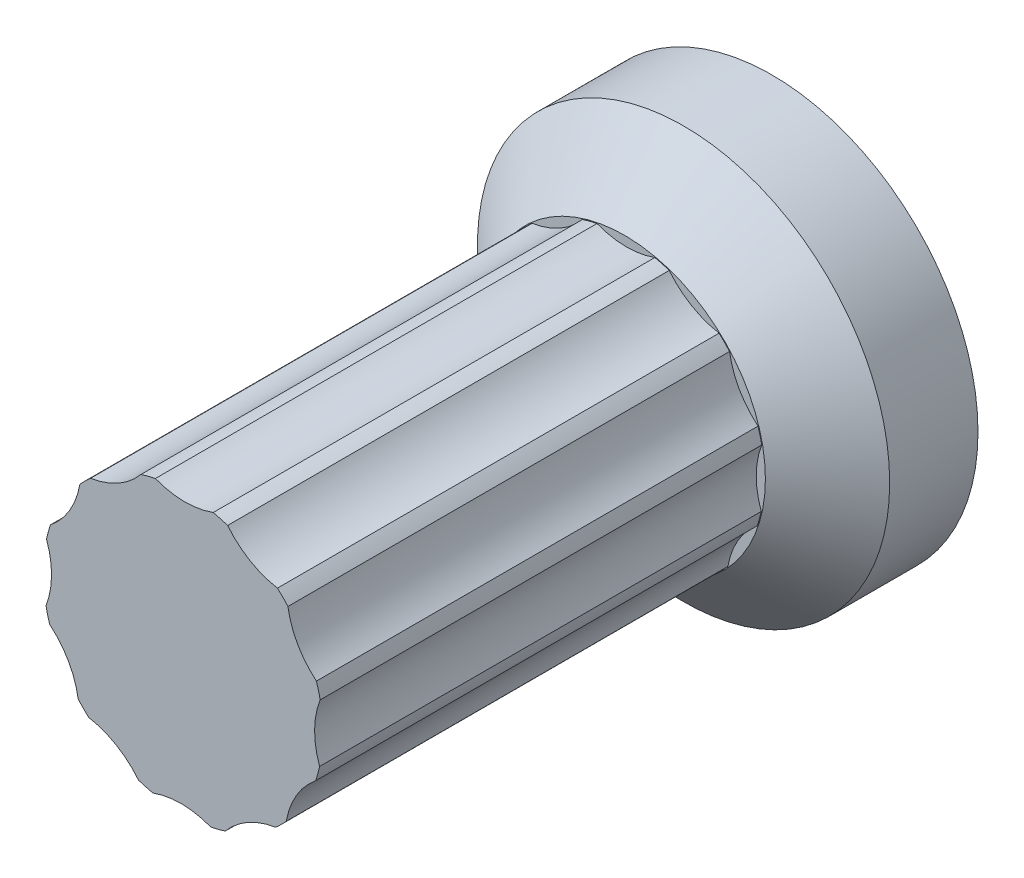
ISO-10303-21;
HEADER;
FILE_DESCRIPTION(('STEP AP214'),'2;1');
FILE_NAME('part.step','',(''),(''),'','','');
FILE_SCHEMA(('AUTOMOTIVE_DESIGN { 1 0 10303 214 1 1 1 1 }'));
ENDSEC;
DATA;
#1=APPLICATION_CONTEXT('core data for automotive mechanical design processes');
#2=APPLICATION_PROTOCOL_DEFINITION('international standard','automotive_design',2000,#1);
#3=PRODUCT_CONTEXT('',#1,'mechanical');
#4=PRODUCT('Part','Part','',(#3));
#5=PRODUCT_RELATED_PRODUCT_CATEGORY('part','',(#4));
#6=PRODUCT_DEFINITION_FORMATION('','',#4);
#7=PRODUCT_DEFINITION_CONTEXT('part definition',#1,'design');
#8=PRODUCT_DEFINITION('design','',#6,#7);
#9=PRODUCT_DEFINITION_SHAPE('','',#8);
#10=(LENGTH_UNIT() NAMED_UNIT(*) SI_UNIT(.MILLI.,.METRE.));
#11=(NAMED_UNIT(*) PLANE_ANGLE_UNIT() SI_UNIT($,.RADIAN.));
#12=(NAMED_UNIT(*) SI_UNIT($,.STERADIAN.) SOLID_ANGLE_UNIT());
#13=UNCERTAINTY_MEASURE_WITH_UNIT(LENGTH_MEASURE(1.E-05),#10,'distance_accuracy_value','');
#14=(GEOMETRIC_REPRESENTATION_CONTEXT(3) GLOBAL_UNCERTAINTY_ASSIGNED_CONTEXT((#13)) GLOBAL_UNIT_ASSIGNED_CONTEXT((#10,
#11,#12)) REPRESENTATION_CONTEXT('',''));
#15=CARTESIAN_POINT('',(0.,0.,0.));
#16=DIRECTION('',(0.,0.,1.));
#17=DIRECTION('',(1.,0.,0.));
#18=AXIS2_PLACEMENT_3D('',#15,#16,#17);
#19=CARTESIAN_POINT('',(0.,0.,20.));
#20=DIRECTION('',(0.,0.,-1.));
#21=DIRECTION('',(-1.,0.,0.));
#22=AXIS2_PLACEMENT_3D('',#19,#20,#21);
#23=CYLINDRICAL_SURFACE('',#22,4.75);
#24=CARTESIAN_POINT('',(0.,0.,5.));
#25=DIRECTION('',(0.,0.,1.));
#26=DIRECTION('',(1.,0.,0.));
#27=AXIS2_PLACEMENT_3D('',#24,#25,#26);
#28=CIRCLE('',#27,4.75);
#29=CARTESIAN_POINT('',(-3.14318374274492,3.56130537294179,5.));
#30=VERTEX_POINT('',#29);
#31=CARTESIAN_POINT('',(-3.50480657144831,3.20606158654708,5.));
#32=VERTEX_POINT('',#31);
#33=EDGE_CURVE('E223',#30,#32,#28,.T.);
#34=ORIENTED_EDGE('',*,*,#33,.T.);
#35=DIRECTION('',(0.,0.,1.));
#36=VECTOR('',#35,1.);
#37=CARTESIAN_POINT('',(-3.50480657144831,3.20606158654708,5.));
#38=LINE('',#37,#36);
#39=CARTESIAN_POINT('',(-3.50480657144831,3.20606158654708,20.));
#40=VERTEX_POINT('',#39);
#41=EDGE_CURVE('E202',#32,#40,#38,.T.);
#42=ORIENTED_EDGE('',*,*,#41,.T.);
#43=CARTESIAN_POINT('',(0.,0.,20.));
#44=DIRECTION('',(0.,0.,1.));
#45=DIRECTION('',(1.,0.,0.));
#46=AXIS2_PLACEMENT_3D('',#43,#44,#45);
#47=CIRCLE('',#46,4.75);
#48=CARTESIAN_POINT('',(-3.14318374274492,3.56130537294178,20.));
#49=VERTEX_POINT('',#48);
#50=EDGE_CURVE('E317',#49,#40,#47,.T.);
#51=ORIENTED_EDGE('',*,*,#50,.F.);
#52=DIRECTION('',(0.,0.,1.));
#53=VECTOR('',#52,1.);
#54=CARTESIAN_POINT('',(-3.14318374274492,3.56130537294179,5.));
#55=LINE('',#54,#53);
#56=EDGE_CURVE('E299',#30,#49,#55,.T.);
#57=ORIENTED_EDGE('',*,*,#56,.F.);
#58=EDGE_LOOP('',(#34,#42,#51,#57));
#59=FACE_BOUND('',#58,.T.);
#60=ADVANCED_FACE('F36',(#59),#23,.T.);
#61=CARTESIAN_POINT('',(-4.50272965645025,1.51258905222913,20.));
#62=VERTEX_POINT('',#61);
#63=CARTESIAN_POINT('',(-4.63828231949841,1.02412749432305,20.));
#64=VERTEX_POINT('',#63);
#65=EDGE_CURVE('E216',#62,#64,#47,.T.);
#66=ORIENTED_EDGE('',*,*,#65,.F.);
#67=DIRECTION('',(0.,0.,1.));
#68=VECTOR('',#67,1.);
#69=CARTESIAN_POINT('',(-4.50272965645025,1.51258905222913,5.));
#70=LINE('',#69,#68);
#71=CARTESIAN_POINT('',(-4.50272965645025,1.51258905222913,5.));
#72=VERTEX_POINT('',#71);
#73=EDGE_CURVE('E199',#72,#62,#70,.T.);
#74=ORIENTED_EDGE('',*,*,#73,.F.);
#75=CARTESIAN_POINT('',(-4.63828231949841,1.02412749432305,5.));
#76=VERTEX_POINT('',#75);
#77=EDGE_CURVE('E214',#72,#76,#28,.T.);
#78=ORIENTED_EDGE('',*,*,#77,.T.);
#79=DIRECTION('',(0.,0.,1.));
#80=VECTOR('',#79,1.);
#81=CARTESIAN_POINT('',(-4.63828231949841,1.02412749432305,5.));
#82=LINE('',#81,#80);
#83=EDGE_CURVE('E352',#76,#64,#82,.T.);
#84=ORIENTED_EDGE('',*,*,#83,.T.);
#85=EDGE_LOOP('',(#66,#74,#78,#84));
#86=FACE_BOUND('',#85,.T.);
#87=ADVANCED_FACE('F212',(#86),#23,.T.);
#88=CARTESIAN_POINT('',(-4.65577279497406,-0.941424283508472,20.));
#89=VERTEX_POINT('',#88);
#90=CARTESIAN_POINT('',(-4.52893406577136,-1.43222073295135,20.));
#91=VERTEX_POINT('',#90);
#92=EDGE_CURVE('E344',#89,#91,#47,.T.);
#93=ORIENTED_EDGE('',*,*,#92,.F.);
#94=DIRECTION('',(0.,0.,1.));
#95=VECTOR('',#94,1.);
#96=CARTESIAN_POINT('',(-4.65577279497406,-0.941424283508473,5.));
#97=LINE('',#96,#95);
#98=CARTESIAN_POINT('',(-4.65577279497406,-0.941424283508473,5.));
#99=VERTEX_POINT('',#98);
#100=EDGE_CURVE('E354',#99,#89,#97,.T.);
#101=ORIENTED_EDGE('',*,*,#100,.F.);
#102=CARTESIAN_POINT('',(-4.52893406577136,-1.43222073295135,5.));
#103=VERTEX_POINT('',#102);
#104=EDGE_CURVE('E224',#99,#103,#28,.T.);
#105=ORIENTED_EDGE('',*,*,#104,.T.);
#106=DIRECTION('',(0.,0.,1.));
#107=VECTOR('',#106,1.);
#108=CARTESIAN_POINT('',(-4.52893406577136,-1.43222073295135,5.));
#109=LINE('',#108,#107);
#110=EDGE_CURVE('E359',#103,#91,#109,.T.);
#111=ORIENTED_EDGE('',*,*,#110,.T.);
#112=EDGE_LOOP('',(#93,#101,#105,#111));
#113=FACE_BOUND('',#112,.T.);
#114=ADVANCED_FACE('F263',(#113),#23,.T.);
#115=CARTESIAN_POINT('',(-3.56130537294178,-3.14318374274493,20.));
#116=VERTEX_POINT('',#115);
#117=CARTESIAN_POINT('',(-3.20606158654706,-3.50480657144832,20.));
#118=VERTEX_POINT('',#117);
#119=EDGE_CURVE('E340',#116,#118,#47,.T.);
#120=ORIENTED_EDGE('',*,*,#119,.F.);
#121=DIRECTION('',(0.,0.,1.));
#122=VECTOR('',#121,1.);
#123=CARTESIAN_POINT('',(-3.56130537294178,-3.14318374274494,5.));
#124=LINE('',#123,#122);
#125=CARTESIAN_POINT('',(-3.56130537294178,-3.14318374274494,5.));
#126=VERTEX_POINT('',#125);
#127=EDGE_CURVE('E365',#126,#116,#124,.T.);
#128=ORIENTED_EDGE('',*,*,#127,.F.);
#129=CARTESIAN_POINT('',(-3.20606158654706,-3.50480657144832,5.));
#130=VERTEX_POINT('',#129);
#131=EDGE_CURVE('E228',#126,#130,#28,.T.);
#132=ORIENTED_EDGE('',*,*,#131,.T.);
#133=DIRECTION('',(0.,0.,1.));
#134=VECTOR('',#133,1.);
#135=CARTESIAN_POINT('',(-3.20606158654706,-3.50480657144832,5.));
#136=LINE('',#135,#134);
#137=EDGE_CURVE('E368',#130,#118,#136,.T.);
#138=ORIENTED_EDGE('',*,*,#137,.T.);
#139=EDGE_LOOP('',(#120,#128,#132,#138));
#140=FACE_BOUND('',#139,.T.);
#141=ADVANCED_FACE('F469',(#140),#23,.T.);
#142=CARTESIAN_POINT('',(-1.51258905222912,-4.50272965645025,20.));
#143=VERTEX_POINT('',#142);
#144=CARTESIAN_POINT('',(-1.02412749432307,-4.63828231949841,20.));
#145=VERTEX_POINT('',#144);
#146=EDGE_CURVE('E336',#143,#145,#47,.T.);
#147=ORIENTED_EDGE('',*,*,#146,.F.);
#148=DIRECTION('',(0.,0.,1.));
#149=VECTOR('',#148,1.);
#150=CARTESIAN_POINT('',(-1.51258905222912,-4.50272965645025,5.));
#151=LINE('',#150,#149);
#152=CARTESIAN_POINT('',(-1.51258905222912,-4.50272965645025,5.));
#153=VERTEX_POINT('',#152);
#154=EDGE_CURVE('E375',#153,#143,#151,.T.);
#155=ORIENTED_EDGE('',*,*,#154,.F.);
#156=CARTESIAN_POINT('',(-1.02412749432307,-4.63828231949841,5.));
#157=VERTEX_POINT('',#156);
#158=EDGE_CURVE('E457',#153,#157,#28,.T.);
#159=ORIENTED_EDGE('',*,*,#158,.T.);
#160=DIRECTION('',(0.,0.,1.));
#161=VECTOR('',#160,1.);
#162=CARTESIAN_POINT('',(-1.02412749432307,-4.63828231949841,5.));
#163=LINE('',#162,#161);
#164=EDGE_CURVE('E378',#157,#145,#163,.T.);
#165=ORIENTED_EDGE('',*,*,#164,.T.);
#166=EDGE_LOOP('',(#147,#155,#159,#165));
#167=FACE_BOUND('',#166,.T.);
#168=ADVANCED_FACE('F472',(#167),#23,.T.);
#169=CARTESIAN_POINT('',(0.941424283508456,-4.65577279497406,20.));
#170=VERTEX_POINT('',#169);
#171=CARTESIAN_POINT('',(1.43222073295136,-4.52893406577136,20.));
#172=VERTEX_POINT('',#171);
#173=EDGE_CURVE('E332',#170,#172,#47,.T.);
#174=ORIENTED_EDGE('',*,*,#173,.F.);
#175=DIRECTION('',(0.,0.,1.));
#176=VECTOR('',#175,1.);
#177=CARTESIAN_POINT('',(0.941424283508457,-4.65577279497406,5.));
#178=LINE('',#177,#176);
#179=CARTESIAN_POINT('',(0.941424283508457,-4.65577279497406,5.));
#180=VERTEX_POINT('',#179);
#181=EDGE_CURVE('E385',#180,#170,#178,.T.);
#182=ORIENTED_EDGE('',*,*,#181,.F.);
#183=CARTESIAN_POINT('',(1.43222073295136,-4.52893406577136,5.));
#184=VERTEX_POINT('',#183);
#185=EDGE_CURVE('E452',#180,#184,#28,.T.);
#186=ORIENTED_EDGE('',*,*,#185,.T.);
#187=DIRECTION('',(0.,0.,1.));
#188=VECTOR('',#187,1.);
#189=CARTESIAN_POINT('',(1.43222073295136,-4.52893406577136,5.));
#190=LINE('',#189,#188);
#191=EDGE_CURVE('E388',#184,#172,#190,.T.);
#192=ORIENTED_EDGE('',*,*,#191,.T.);
#193=EDGE_LOOP('',(#174,#182,#186,#192));
#194=FACE_BOUND('',#193,.T.);
#195=ADVANCED_FACE('F585',(#194),#23,.T.);
#196=CARTESIAN_POINT('',(3.14318374274495,-3.56130537294176,20.));
#197=VERTEX_POINT('',#196);
#198=CARTESIAN_POINT('',(3.50480657144833,-3.20606158654705,20.));
#199=VERTEX_POINT('',#198);
#200=EDGE_CURVE('E328',#197,#199,#47,.T.);
#201=ORIENTED_EDGE('',*,*,#200,.F.);
#202=DIRECTION('',(0.,0.,1.));
#203=VECTOR('',#202,1.);
#204=CARTESIAN_POINT('',(3.14318374274495,-3.56130537294176,5.));
#205=LINE('',#204,#203);
#206=CARTESIAN_POINT('',(3.14318374274495,-3.56130537294176,5.));
#207=VERTEX_POINT('',#206);
#208=EDGE_CURVE('E395',#207,#197,#205,.T.);
#209=ORIENTED_EDGE('',*,*,#208,.F.);
#210=CARTESIAN_POINT('',(3.50480657144833,-3.20606158654705,5.));
#211=VERTEX_POINT('',#210);
#212=EDGE_CURVE('E447',#207,#211,#28,.T.);
#213=ORIENTED_EDGE('',*,*,#212,.T.);
#214=DIRECTION('',(0.,0.,1.));
#215=VECTOR('',#214,1.);
#216=CARTESIAN_POINT('',(3.50480657144833,-3.20606158654705,5.));
#217=LINE('',#216,#215);
#218=EDGE_CURVE('E398',#211,#199,#217,.T.);
#219=ORIENTED_EDGE('',*,*,#218,.T.);
#220=EDGE_LOOP('',(#201,#209,#213,#219));
#221=FACE_BOUND('',#220,.T.);
#222=ADVANCED_FACE('F477',(#221),#23,.T.);
#223=CARTESIAN_POINT('',(4.50272965645026,-1.5125890522291,20.));
#224=VERTEX_POINT('',#223);
#225=CARTESIAN_POINT('',(4.63828231949842,-1.02412749432302,20.));
#226=VERTEX_POINT('',#225);
#227=EDGE_CURVE('E324',#224,#226,#47,.T.);
#228=ORIENTED_EDGE('',*,*,#227,.F.);
#229=DIRECTION('',(0.,0.,1.));
#230=VECTOR('',#229,1.);
#231=CARTESIAN_POINT('',(4.50272965645026,-1.5125890522291,5.));
#232=LINE('',#231,#230);
#233=CARTESIAN_POINT('',(4.50272965645026,-1.5125890522291,5.));
#234=VERTEX_POINT('',#233);
#235=EDGE_CURVE('E405',#234,#224,#232,.T.);
#236=ORIENTED_EDGE('',*,*,#235,.F.);
#237=CARTESIAN_POINT('',(4.63828231949842,-1.02412749432302,5.));
#238=VERTEX_POINT('',#237);
#239=EDGE_CURVE('E442',#234,#238,#28,.T.);
#240=ORIENTED_EDGE('',*,*,#239,.T.);
#241=DIRECTION('',(0.,0.,1.));
#242=VECTOR('',#241,1.);
#243=CARTESIAN_POINT('',(4.63828231949842,-1.02412749432302,5.));
#244=LINE('',#243,#242);
#245=EDGE_CURVE('E408',#238,#226,#244,.T.);
#246=ORIENTED_EDGE('',*,*,#245,.T.);
#247=EDGE_LOOP('',(#228,#236,#240,#246));
#248=FACE_BOUND('',#247,.T.);
#249=ADVANCED_FACE('F592',(#248),#23,.T.);
#250=CARTESIAN_POINT('',(4.65577279497405,0.941424283508504,20.));
#251=VERTEX_POINT('',#250);
#252=CARTESIAN_POINT('',(4.52893406577135,1.43222073295138,20.));
#253=VERTEX_POINT('',#252);
#254=EDGE_CURVE('E321',#251,#253,#47,.T.);
#255=ORIENTED_EDGE('',*,*,#254,.F.);
#256=DIRECTION('',(0.,0.,1.));
#257=VECTOR('',#256,1.);
#258=CARTESIAN_POINT('',(4.65577279497405,0.941424283508505,5.));
#259=LINE('',#258,#257);
#260=CARTESIAN_POINT('',(4.65577279497405,0.941424283508505,5.));
#261=VERTEX_POINT('',#260);
#262=EDGE_CURVE('E415',#261,#251,#259,.T.);
#263=ORIENTED_EDGE('',*,*,#262,.F.);
#264=CARTESIAN_POINT('',(4.52893406577135,1.43222073295138,5.));
#265=VERTEX_POINT('',#264);
#266=EDGE_CURVE('E440',#261,#265,#28,.T.);
#267=ORIENTED_EDGE('',*,*,#266,.T.);
#268=DIRECTION('',(0.,0.,1.));
#269=VECTOR('',#268,1.);
#270=CARTESIAN_POINT('',(4.52893406577135,1.43222073295138,5.));
#271=LINE('',#270,#269);
#272=EDGE_CURVE('E418',#265,#253,#271,.T.);
#273=ORIENTED_EDGE('',*,*,#272,.T.);
#274=EDGE_LOOP('',(#255,#263,#267,#273));
#275=FACE_BOUND('',#274,.T.);
#276=ADVANCED_FACE('F284',(#275),#23,.T.);
#277=CARTESIAN_POINT('',(3.56130537294175,3.14318374274496,20.));
#278=VERTEX_POINT('',#277);
#279=CARTESIAN_POINT('',(3.20606158654704,3.50480657144834,20.));
#280=VERTEX_POINT('',#279);
#281=EDGE_CURVE('E319',#278,#280,#47,.T.);
#282=ORIENTED_EDGE('',*,*,#281,.F.);
#283=DIRECTION('',(0.,0.,1.));
#284=VECTOR('',#283,1.);
#285=CARTESIAN_POINT('',(3.56130537294175,3.14318374274496,5.));
#286=LINE('',#285,#284);
#287=CARTESIAN_POINT('',(3.56130537294175,3.14318374274496,5.));
#288=VERTEX_POINT('',#287);
#289=EDGE_CURVE('E59',#288,#278,#286,.T.);
#290=ORIENTED_EDGE('',*,*,#289,.F.);
#291=CARTESIAN_POINT('',(3.20606158654704,3.50480657144834,5.));
#292=VERTEX_POINT('',#291);
#293=EDGE_CURVE('E438',#288,#292,#28,.T.);
#294=ORIENTED_EDGE('',*,*,#293,.T.);
#295=DIRECTION('',(0.,0.,1.));
#296=VECTOR('',#295,1.);
#297=CARTESIAN_POINT('',(3.20606158654704,3.50480657144834,5.));
#298=LINE('',#297,#296);
#299=EDGE_CURVE('E427',#292,#280,#298,.T.);
#300=ORIENTED_EDGE('',*,*,#299,.T.);
#301=EDGE_LOOP('',(#282,#290,#294,#300));
#302=FACE_BOUND('',#301,.T.);
#303=ADVANCED_FACE('F277',(#302),#23,.T.);
#304=CARTESIAN_POINT('',(-0.941424283508457,4.65577279497406,5.));
#305=VERTEX_POINT('',#304);
#306=CARTESIAN_POINT('',(-1.43222073295133,4.52893406577136,5.));
#307=VERTEX_POINT('',#306);
#308=EDGE_CURVE('E226',#305,#307,#28,.T.);
#309=ORIENTED_EDGE('',*,*,#308,.T.);
#310=DIRECTION('',(0.,0.,1.));
#311=VECTOR('',#310,1.);
#312=CARTESIAN_POINT('',(-1.43222073295133,4.52893406577136,5.));
#313=LINE('',#312,#311);
#314=CARTESIAN_POINT('',(-1.43222073295133,4.52893406577136,20.));
#315=VERTEX_POINT('',#314);
#316=EDGE_CURVE('E289',#307,#315,#313,.T.);
#317=ORIENTED_EDGE('',*,*,#316,.T.);
#318=CARTESIAN_POINT('',(-0.941424283508456,4.65577279497406,20.));
#319=VERTEX_POINT('',#318);
#320=EDGE_CURVE('E234',#319,#315,#47,.T.);
#321=ORIENTED_EDGE('',*,*,#320,.F.);
#322=DIRECTION('',(0.,0.,1.));
#323=VECTOR('',#322,1.);
#324=CARTESIAN_POINT('',(-0.941424283508457,4.65577279497406,5.));
#325=LINE('',#324,#323);
#326=EDGE_CURVE('E291',#305,#319,#325,.T.);
#327=ORIENTED_EDGE('',*,*,#326,.F.);
#328=EDGE_LOOP('',(#309,#317,#321,#327));
#329=FACE_BOUND('',#328,.T.);
#330=ADVANCED_FACE('F268',(#329),#23,.T.);
#331=CARTESIAN_POINT('',(0.,0.,5.));
#332=DIRECTION('',(0.,0.,-1.));
#333=DIRECTION('',(-1.,0.,0.));
#334=AXIS2_PLACEMENT_3D('',#331,#332,#333);
#335=CYLINDRICAL_SURFACE('',#334,7.);
#336=CARTESIAN_POINT('',(0.,0.,3.));
#337=DIRECTION('',(0.,0.,1.));
#338=DIRECTION('',(1.,0.,0.));
#339=AXIS2_PLACEMENT_3D('',#336,#337,#338);
#340=CIRCLE('',#339,7.);
#341=CARTESIAN_POINT('',(7.,0.,3.));
#342=VERTEX_POINT('',#341);
#343=EDGE_CURVE('E11',#342,#342,#340,.F.);
#344=ORIENTED_EDGE('',*,*,#343,.T.);
#345=EDGE_LOOP('',(#344));
#346=FACE_BOUND('',#345,.T.);
#347=CARTESIAN_POINT('',(0.,0.,0.));
#348=DIRECTION('',(0.,0.,1.));
#349=DIRECTION('',(1.,0.,0.));
#350=AXIS2_PLACEMENT_3D('',#347,#348,#349);
#351=CIRCLE('',#350,7.);
#352=CARTESIAN_POINT('',(7.,0.,0.));
#353=VERTEX_POINT('',#352);
#354=EDGE_CURVE('E236',#353,#353,#351,.T.);
#355=ORIENTED_EDGE('',*,*,#354,.T.);
#356=EDGE_LOOP('',(#355));
#357=FACE_BOUND('',#356,.T.);
#358=ADVANCED_FACE('F276',(#346,#357),#335,.T.);
#359=CARTESIAN_POINT('',(0.,0.,5.));
#360=DIRECTION('',(0.,0.,1.));
#361=DIRECTION('',(1.,0.,0.));
#362=AXIS2_PLACEMENT_3D('',#359,#360,#361);
#363=PLANE('',#362);
#364=CARTESIAN_POINT('',(0.,0.,5.));
#365=DIRECTION('',(0.,0.,1.));
#366=DIRECTION('',(1.,0.,0.));
#367=AXIS2_PLACEMENT_3D('',#364,#365,#366);
#368=CIRCLE('',#367,4.77877497034162);
#369=CARTESIAN_POINT('',(4.77877497034162,0.,5.));
#370=VERTEX_POINT('',#369);
#371=EDGE_CURVE('E44',#370,#370,#368,.T.);
#372=ORIENTED_EDGE('',*,*,#371,.T.);
#373=EDGE_LOOP('',(#372));
#374=FACE_BOUND('',#373,.T.);
#375=ORIENTED_EDGE('',*,*,#308,.F.);
#376=CARTESIAN_POINT('',(0.0644882214723457,7.2470836222042,5.));
#377=DIRECTION('',(0.,0.,1.));
#378=DIRECTION('',(1.,0.,0.));
#379=AXIS2_PLACEMENT_3D('',#376,#377,#378);
#380=CIRCLE('',#379,2.77970354012742);
#381=CARTESIAN_POINT('',(1.02412749432307,4.63828231949841,5.));
#382=VERTEX_POINT('',#381);
#383=EDGE_CURVE('E295',#305,#382,#380,.T.);
#384=ORIENTED_EDGE('',*,*,#383,.T.);
#385=CARTESIAN_POINT('',(1.51258905222909,4.50272965645026,5.));
#386=VERTEX_POINT('',#385);
#387=EDGE_CURVE('E233',#386,#382,#28,.T.);
#388=ORIENTED_EDGE('',*,*,#387,.F.);
#389=CARTESIAN_POINT('',(3.67939024914195,6.24391440944286,5.));
#390=DIRECTION('',(0.,0.,1.));
#391=DIRECTION('',(0.866025403784445,-0.499999999999989,0.));
#392=AXIS2_PLACEMENT_3D('',#389,#390,#391);
#393=CIRCLE('',#392,2.77970354012742);
#394=EDGE_CURVE('E431',#386,#292,#393,.T.);
#395=ORIENTED_EDGE('',*,*,#394,.T.);
#396=ORIENTED_EDGE('',*,*,#293,.F.);
#397=CARTESIAN_POINT('',(6.30840263091512,3.56769337306225,5.));
#398=DIRECTION('',(0.,0.,1.));
#399=DIRECTION('',(0.50000000000001,-0.866025403784433,0.));
#400=AXIS2_PLACEMENT_3D('',#397,#398,#399);
#401=CIRCLE('',#400,2.77970354012742);
#402=EDGE_CURVE('E422',#288,#265,#401,.T.);
#403=ORIENTED_EDGE('',*,*,#402,.T.);
#404=ORIENTED_EDGE('',*,*,#266,.F.);
#405=CARTESIAN_POINT('',(7.2470836222042,-0.0644882214722698,5.));
#406=DIRECTION('',(0.,0.,1.));
#407=DIRECTION('',(0.,-1.,0.));
#408=AXIS2_PLACEMENT_3D('',#405,#406,#407);
#409=CIRCLE('',#408,2.77970354012742);
#410=EDGE_CURVE('E412',#261,#238,#409,.T.);
#411=ORIENTED_EDGE('',*,*,#410,.T.);
#412=ORIENTED_EDGE('',*,*,#239,.F.);
#413=CARTESIAN_POINT('',(6.24391440944285,-3.67939024914197,5.));
#414=DIRECTION('',(0.,0.,1.));
#415=DIRECTION('',(-0.499999999999992,-0.866025403784443,0.));
#416=AXIS2_PLACEMENT_3D('',#413,#414,#415);
#417=CIRCLE('',#416,2.77970354012742);
#418=EDGE_CURVE('E402',#234,#211,#417,.T.);
#419=ORIENTED_EDGE('',*,*,#418,.T.);
#420=ORIENTED_EDGE('',*,*,#212,.F.);
#421=CARTESIAN_POINT('',(3.56769337306222,-6.30840263091513,5.));
#422=DIRECTION('',(0.,0.,1.));
#423=DIRECTION('',(-0.866025403784435,-0.500000000000007,0.));
#424=AXIS2_PLACEMENT_3D('',#421,#422,#423);
#425=CIRCLE('',#424,2.77970354012742);
#426=EDGE_CURVE('E392',#207,#184,#425,.T.);
#427=ORIENTED_EDGE('',*,*,#426,.T.);
#428=ORIENTED_EDGE('',*,*,#185,.F.);
#429=CARTESIAN_POINT('',(-0.0644882214723457,-7.2470836222042,5.));
#430=DIRECTION('',(0.,0.,1.));
#431=DIRECTION('',(-1.,0.,0.));
#432=AXIS2_PLACEMENT_3D('',#429,#430,#431);
#433=CIRCLE('',#432,2.77970354012742);
#434=EDGE_CURVE('E382',#180,#157,#433,.T.);
#435=ORIENTED_EDGE('',*,*,#434,.T.);
#436=ORIENTED_EDGE('',*,*,#158,.F.);
#437=CARTESIAN_POINT('',(-3.67939024914199,-6.24391440944283,5.));
#438=DIRECTION('',(0.,0.,1.));
#439=DIRECTION('',(-0.866025403784442,0.499999999999995,0.));
#440=AXIS2_PLACEMENT_3D('',#437,#438,#439);
#441=CIRCLE('',#440,2.77970354012742);
#442=EDGE_CURVE('E372',#153,#130,#441,.T.);
#443=ORIENTED_EDGE('',*,*,#442,.T.);
#444=ORIENTED_EDGE('',*,*,#131,.F.);
#445=CARTESIAN_POINT('',(-6.30840263091514,-3.5676933730622,5.));
#446=DIRECTION('',(0.,0.,1.));
#447=DIRECTION('',(-0.500000000000004,0.866025403784436,0.));
#448=AXIS2_PLACEMENT_3D('',#445,#446,#447);
#449=CIRCLE('',#448,2.77970354012742);
#450=EDGE_CURVE('E362',#126,#103,#449,.T.);
#451=ORIENTED_EDGE('',*,*,#450,.T.);
#452=ORIENTED_EDGE('',*,*,#104,.F.);
#453=CARTESIAN_POINT('',(-7.2470836222042,0.0644882214723204,5.));
#454=DIRECTION('',(0.,0.,1.));
#455=DIRECTION('',(0.,1.,0.));
#456=AXIS2_PLACEMENT_3D('',#453,#454,#455);
#457=CIRCLE('',#456,2.77970354012742);
#458=EDGE_CURVE('E222',#99,#76,#457,.T.);
#459=ORIENTED_EDGE('',*,*,#458,.T.);
#460=ORIENTED_EDGE('',*,*,#77,.F.);
#461=CARTESIAN_POINT('',(-6.24391440944282,3.67939024914202,5.));
#462=DIRECTION('',(0.,0.,1.));
#463=DIRECTION('',(0.499999999999998,0.86602540378444,0.));
#464=AXIS2_PLACEMENT_3D('',#461,#462,#463);
#465=CIRCLE('',#464,2.77970354012742);
#466=EDGE_CURVE('E196',#72,#32,#465,.T.);
#467=ORIENTED_EDGE('',*,*,#466,.T.);
#468=ORIENTED_EDGE('',*,*,#33,.F.);
#469=CARTESIAN_POINT('',(-3.56769337306218,6.30840263091515,5.));
#470=DIRECTION('',(0.,0.,1.));
#471=DIRECTION('',(0.866025403784438,0.500000000000001,0.));
#472=AXIS2_PLACEMENT_3D('',#469,#470,#471);
#473=CIRCLE('',#472,2.77970354012742);
#474=EDGE_CURVE('E296',#30,#307,#473,.T.);
#475=ORIENTED_EDGE('',*,*,#474,.T.);
#476=EDGE_LOOP('',(#375,#384,#388,#395,#396,#403,#404,#411,#412,#419,#420,#427,#428,#435,#436,
#443,#444,#451,#452,#459,#460,#467,#468,#475));
#477=FACE_BOUND('',#476,.T.);
#478=ADVANCED_FACE('F220',(#374,#477),#363,.T.);
#479=CARTESIAN_POINT('',(0.,0.,0.));
#480=DIRECTION('',(0.,0.,1.));
#481=DIRECTION('',(1.,0.,0.));
#482=AXIS2_PLACEMENT_3D('',#479,#480,#481);
#483=PLANE('',#482);
#484=ORIENTED_EDGE('',*,*,#354,.F.);
#485=EDGE_LOOP('',(#484));
#486=FACE_BOUND('',#485,.T.);
#487=ADVANCED_FACE('F266',(#486),#483,.F.);
#488=CARTESIAN_POINT('',(1.51258905222909,4.50272965645026,20.));
#489=VERTEX_POINT('',#488);
#490=CARTESIAN_POINT('',(1.02412749432307,4.63828231949841,20.));
#491=VERTEX_POINT('',#490);
#492=EDGE_CURVE('E232',#489,#491,#47,.T.);
#493=ORIENTED_EDGE('',*,*,#492,.F.);
#494=DIRECTION('',(0.,0.,1.));
#495=VECTOR('',#494,1.);
#496=CARTESIAN_POINT('',(1.51258905222909,4.50272965645026,5.));
#497=LINE('',#496,#495);
#498=EDGE_CURVE('E51',#386,#489,#497,.T.);
#499=ORIENTED_EDGE('',*,*,#498,.F.);
#500=ORIENTED_EDGE('',*,*,#387,.T.);
#501=DIRECTION('',(0.,0.,1.));
#502=VECTOR('',#501,1.);
#503=CARTESIAN_POINT('',(1.02412749432307,4.63828231949841,5.));
#504=LINE('',#503,#502);
#505=EDGE_CURVE('E312',#382,#491,#504,.T.);
#506=ORIENTED_EDGE('',*,*,#505,.T.);
#507=EDGE_LOOP('',(#493,#499,#500,#506));
#508=FACE_BOUND('',#507,.T.);
#509=ADVANCED_FACE('F253',(#508),#23,.T.);
#510=CARTESIAN_POINT('',(0.,0.,20.));
#511=DIRECTION('',(0.,0.,1.));
#512=DIRECTION('',(1.,0.,0.));
#513=AXIS2_PLACEMENT_3D('',#510,#511,#512);
#514=PLANE('',#513);
#515=CARTESIAN_POINT('',(-6.24391440944282,3.67939024914202,20.));
#516=DIRECTION('',(0.,0.,1.));
#517=DIRECTION('',(0.499999999999998,0.86602540378444,0.));
#518=AXIS2_PLACEMENT_3D('',#515,#516,#517);
#519=CIRCLE('',#518,2.77970354012742);
#520=EDGE_CURVE('E207',#62,#40,#519,.T.);
#521=ORIENTED_EDGE('',*,*,#520,.F.);
#522=ORIENTED_EDGE('',*,*,#65,.T.);
#523=CARTESIAN_POINT('',(-7.2470836222042,0.0644882214723204,20.));
#524=DIRECTION('',(0.,0.,1.));
#525=DIRECTION('',(0.,1.,0.));
#526=AXIS2_PLACEMENT_3D('',#523,#524,#525);
#527=CIRCLE('',#526,2.77970354012742);
#528=EDGE_CURVE('E350',#89,#64,#527,.T.);
#529=ORIENTED_EDGE('',*,*,#528,.F.);
#530=ORIENTED_EDGE('',*,*,#92,.T.);
#531=CARTESIAN_POINT('',(-6.30840263091514,-3.5676933730622,20.));
#532=DIRECTION('',(0.,0.,1.));
#533=DIRECTION('',(-0.500000000000004,0.866025403784436,0.));
#534=AXIS2_PLACEMENT_3D('',#531,#532,#533);
#535=CIRCLE('',#534,2.77970354012742);
#536=EDGE_CURVE('E366',#116,#91,#535,.T.);
#537=ORIENTED_EDGE('',*,*,#536,.F.);
#538=ORIENTED_EDGE('',*,*,#119,.T.);
#539=CARTESIAN_POINT('',(-3.67939024914199,-6.24391440944283,20.));
#540=DIRECTION('',(0.,0.,1.));
#541=DIRECTION('',(-0.866025403784442,0.499999999999995,0.));
#542=AXIS2_PLACEMENT_3D('',#539,#540,#541);
#543=CIRCLE('',#542,2.77970354012742);
#544=EDGE_CURVE('E376',#143,#118,#543,.T.);
#545=ORIENTED_EDGE('',*,*,#544,.F.);
#546=ORIENTED_EDGE('',*,*,#146,.T.);
#547=CARTESIAN_POINT('',(-0.0644882214723457,-7.2470836222042,20.));
#548=DIRECTION('',(0.,0.,1.));
#549=DIRECTION('',(-1.,0.,0.));
#550=AXIS2_PLACEMENT_3D('',#547,#548,#549);
#551=CIRCLE('',#550,2.77970354012742);
#552=EDGE_CURVE('E386',#170,#145,#551,.T.);
#553=ORIENTED_EDGE('',*,*,#552,.F.);
#554=ORIENTED_EDGE('',*,*,#173,.T.);
#555=CARTESIAN_POINT('',(3.56769337306222,-6.30840263091513,20.));
#556=DIRECTION('',(0.,0.,1.));
#557=DIRECTION('',(-0.866025403784435,-0.500000000000007,0.));
#558=AXIS2_PLACEMENT_3D('',#555,#556,#557);
#559=CIRCLE('',#558,2.77970354012742);
#560=EDGE_CURVE('E396',#197,#172,#559,.T.);
#561=ORIENTED_EDGE('',*,*,#560,.F.);
#562=ORIENTED_EDGE('',*,*,#200,.T.);
#563=CARTESIAN_POINT('',(6.24391440944285,-3.67939024914197,20.));
#564=DIRECTION('',(0.,0.,1.));
#565=DIRECTION('',(-0.499999999999992,-0.866025403784443,0.));
#566=AXIS2_PLACEMENT_3D('',#563,#564,#565);
#567=CIRCLE('',#566,2.77970354012742);
#568=EDGE_CURVE('E406',#224,#199,#567,.T.);
#569=ORIENTED_EDGE('',*,*,#568,.F.);
#570=ORIENTED_EDGE('',*,*,#227,.T.);
#571=CARTESIAN_POINT('',(7.2470836222042,-0.0644882214722698,20.));
#572=DIRECTION('',(0.,0.,1.));
#573=DIRECTION('',(0.,-1.,0.));
#574=AXIS2_PLACEMENT_3D('',#571,#572,#573);
#575=CIRCLE('',#574,2.77970354012742);
#576=EDGE_CURVE('E416',#251,#226,#575,.T.);
#577=ORIENTED_EDGE('',*,*,#576,.F.);
#578=ORIENTED_EDGE('',*,*,#254,.T.);
#579=CARTESIAN_POINT('',(6.30840263091512,3.56769337306225,20.));
#580=DIRECTION('',(0.,0.,1.));
#581=DIRECTION('',(0.50000000000001,-0.866025403784433,0.));
#582=AXIS2_PLACEMENT_3D('',#579,#580,#581);
#583=CIRCLE('',#582,2.77970354012742);
#584=EDGE_CURVE('E425',#278,#253,#583,.T.);
#585=ORIENTED_EDGE('',*,*,#584,.F.);
#586=ORIENTED_EDGE('',*,*,#281,.T.);
#587=CARTESIAN_POINT('',(3.67939024914195,6.24391440944286,20.));
#588=DIRECTION('',(0.,0.,1.));
#589=DIRECTION('',(0.866025403784445,-0.499999999999989,0.));
#590=AXIS2_PLACEMENT_3D('',#587,#588,#589);
#591=CIRCLE('',#590,2.77970354012742);
#592=EDGE_CURVE('E434',#489,#280,#591,.T.);
#593=ORIENTED_EDGE('',*,*,#592,.F.);
#594=ORIENTED_EDGE('',*,*,#492,.T.);
#595=CARTESIAN_POINT('',(0.0644882214723457,7.2470836222042,20.));
#596=DIRECTION('',(0.,0.,1.));
#597=DIRECTION('',(1.,0.,0.));
#598=AXIS2_PLACEMENT_3D('',#595,#596,#597);
#599=CIRCLE('',#598,2.77970354012742);
#600=EDGE_CURVE('E307',#319,#491,#599,.T.);
#601=ORIENTED_EDGE('',*,*,#600,.F.);
#602=ORIENTED_EDGE('',*,*,#320,.T.);
#603=CARTESIAN_POINT('',(-3.56769337306218,6.30840263091515,20.));
#604=DIRECTION('',(0.,0.,1.));
#605=DIRECTION('',(0.866025403784438,0.500000000000001,0.));
#606=AXIS2_PLACEMENT_3D('',#603,#604,#605);
#607=CIRCLE('',#606,2.77970354012742);
#608=EDGE_CURVE('E300',#49,#315,#607,.T.);
#609=ORIENTED_EDGE('',*,*,#608,.F.);
#610=ORIENTED_EDGE('',*,*,#50,.T.);
#611=EDGE_LOOP('',(#521,#522,#529,#530,#537,#538,#545,#546,#553,#554,#561,#562,#569,#570,#577,
#578,#585,#586,#593,#594,#601,#602,#609,#610));
#612=FACE_BOUND('',#611,.T.);
#613=ADVANCED_FACE('F244',(#612),#514,.T.);
#614=CARTESIAN_POINT('',(0.,0.,5.));
#615=DIRECTION('',(0.,0.,-1.));
#616=DIRECTION('',(-1.,0.,0.));
#617=AXIS2_PLACEMENT_3D('',#614,#615,#616);
#618=CONICAL_SURFACE('',#617,4.77877497034162,0.837758040957276);
#619=ORIENTED_EDGE('',*,*,#343,.F.);
#620=EDGE_LOOP('',(#619));
#621=FACE_BOUND('',#620,.T.);
#622=ORIENTED_EDGE('',*,*,#371,.F.);
#623=EDGE_LOOP('',(#622));
#624=FACE_BOUND('',#623,.T.);
#625=ADVANCED_FACE('F38',(#621,#624),#618,.T.);
#626=CARTESIAN_POINT('',(0.0644882214723457,7.2470836222042,5.));
#627=DIRECTION('',(0.,0.,1.));
#628=DIRECTION('',(1.,0.,0.));
#629=AXIS2_PLACEMENT_3D('',#626,#627,#628);
#630=CYLINDRICAL_SURFACE('',#629,2.77970354012742);
#631=ORIENTED_EDGE('',*,*,#600,.T.);
#632=ORIENTED_EDGE('',*,*,#505,.F.);
#633=ORIENTED_EDGE('',*,*,#383,.F.);
#634=ORIENTED_EDGE('',*,*,#326,.T.);
#635=EDGE_LOOP('',(#631,#632,#633,#634));
#636=FACE_BOUND('',#635,.T.);
#637=ADVANCED_FACE('F243',(#636),#630,.F.);
#638=CARTESIAN_POINT('',(-3.56769337306218,6.30840263091515,5.));
#639=DIRECTION('',(0.,0.,1.));
#640=DIRECTION('',(1.,0.,0.));
#641=AXIS2_PLACEMENT_3D('',#638,#639,#640);
#642=CYLINDRICAL_SURFACE('',#641,2.77970354012742);
#643=ORIENTED_EDGE('',*,*,#608,.T.);
#644=ORIENTED_EDGE('',*,*,#316,.F.);
#645=ORIENTED_EDGE('',*,*,#474,.F.);
#646=ORIENTED_EDGE('',*,*,#56,.T.);
#647=EDGE_LOOP('',(#643,#644,#645,#646));
#648=FACE_BOUND('',#647,.T.);
#649=ADVANCED_FACE('F250',(#648),#642,.F.);
#650=CARTESIAN_POINT('',(3.67939024914195,6.24391440944286,5.));
#651=DIRECTION('',(0.,0.,1.));
#652=DIRECTION('',(1.,0.,0.));
#653=AXIS2_PLACEMENT_3D('',#650,#651,#652);
#654=CYLINDRICAL_SURFACE('',#653,2.77970354012742);
#655=ORIENTED_EDGE('',*,*,#592,.T.);
#656=ORIENTED_EDGE('',*,*,#299,.F.);
#657=ORIENTED_EDGE('',*,*,#394,.F.);
#658=ORIENTED_EDGE('',*,*,#498,.T.);
#659=EDGE_LOOP('',(#655,#656,#657,#658));
#660=FACE_BOUND('',#659,.T.);
#661=ADVANCED_FACE('F439',(#660),#654,.F.);
#662=CARTESIAN_POINT('',(6.30840263091512,3.56769337306225,5.));
#663=DIRECTION('',(0.,0.,1.));
#664=DIRECTION('',(1.,0.,0.));
#665=AXIS2_PLACEMENT_3D('',#662,#663,#664);
#666=CYLINDRICAL_SURFACE('',#665,2.77970354012742);
#667=ORIENTED_EDGE('',*,*,#584,.T.);
#668=ORIENTED_EDGE('',*,*,#272,.F.);
#669=ORIENTED_EDGE('',*,*,#402,.F.);
#670=ORIENTED_EDGE('',*,*,#289,.T.);
#671=EDGE_LOOP('',(#667,#668,#669,#670));
#672=FACE_BOUND('',#671,.T.);
#673=ADVANCED_FACE('F482',(#672),#666,.F.);
#674=CARTESIAN_POINT('',(7.2470836222042,-0.0644882214722698,5.));
#675=DIRECTION('',(0.,0.,1.));
#676=DIRECTION('',(1.,0.,0.));
#677=AXIS2_PLACEMENT_3D('',#674,#675,#676);
#678=CYLINDRICAL_SURFACE('',#677,2.77970354012742);
#679=ORIENTED_EDGE('',*,*,#576,.T.);
#680=ORIENTED_EDGE('',*,*,#245,.F.);
#681=ORIENTED_EDGE('',*,*,#410,.F.);
#682=ORIENTED_EDGE('',*,*,#262,.T.);
#683=EDGE_LOOP('',(#679,#680,#681,#682));
#684=FACE_BOUND('',#683,.T.);
#685=ADVANCED_FACE('F481',(#684),#678,.F.);
#686=CARTESIAN_POINT('',(6.24391440944285,-3.67939024914197,5.));
#687=DIRECTION('',(0.,0.,1.));
#688=DIRECTION('',(1.,0.,0.));
#689=AXIS2_PLACEMENT_3D('',#686,#687,#688);
#690=CYLINDRICAL_SURFACE('',#689,2.77970354012742);
#691=ORIENTED_EDGE('',*,*,#568,.T.);
#692=ORIENTED_EDGE('',*,*,#218,.F.);
#693=ORIENTED_EDGE('',*,*,#418,.F.);
#694=ORIENTED_EDGE('',*,*,#235,.T.);
#695=EDGE_LOOP('',(#691,#692,#693,#694));
#696=FACE_BOUND('',#695,.T.);
#697=ADVANCED_FACE('F479',(#696),#690,.F.);
#698=CARTESIAN_POINT('',(3.56769337306222,-6.30840263091513,5.));
#699=DIRECTION('',(0.,0.,1.));
#700=DIRECTION('',(1.,0.,0.));
#701=AXIS2_PLACEMENT_3D('',#698,#699,#700);
#702=CYLINDRICAL_SURFACE('',#701,2.77970354012742);
#703=ORIENTED_EDGE('',*,*,#560,.T.);
#704=ORIENTED_EDGE('',*,*,#191,.F.);
#705=ORIENTED_EDGE('',*,*,#426,.F.);
#706=ORIENTED_EDGE('',*,*,#208,.T.);
#707=EDGE_LOOP('',(#703,#704,#705,#706));
#708=FACE_BOUND('',#707,.T.);
#709=ADVANCED_FACE('F476',(#708),#702,.F.);
#710=CARTESIAN_POINT('',(-0.0644882214723457,-7.2470836222042,5.));
#711=DIRECTION('',(0.,0.,1.));
#712=DIRECTION('',(1.,0.,0.));
#713=AXIS2_PLACEMENT_3D('',#710,#711,#712);
#714=CYLINDRICAL_SURFACE('',#713,2.77970354012742);
#715=ORIENTED_EDGE('',*,*,#552,.T.);
#716=ORIENTED_EDGE('',*,*,#164,.F.);
#717=ORIENTED_EDGE('',*,*,#434,.F.);
#718=ORIENTED_EDGE('',*,*,#181,.T.);
#719=EDGE_LOOP('',(#715,#716,#717,#718));
#720=FACE_BOUND('',#719,.T.);
#721=ADVANCED_FACE('F474',(#720),#714,.F.);
#722=CARTESIAN_POINT('',(-3.67939024914199,-6.24391440944283,5.));
#723=DIRECTION('',(0.,0.,1.));
#724=DIRECTION('',(1.,0.,0.));
#725=AXIS2_PLACEMENT_3D('',#722,#723,#724);
#726=CYLINDRICAL_SURFACE('',#725,2.77970354012742);
#727=ORIENTED_EDGE('',*,*,#544,.T.);
#728=ORIENTED_EDGE('',*,*,#137,.F.);
#729=ORIENTED_EDGE('',*,*,#442,.F.);
#730=ORIENTED_EDGE('',*,*,#154,.T.);
#731=EDGE_LOOP('',(#727,#728,#729,#730));
#732=FACE_BOUND('',#731,.T.);
#733=ADVANCED_FACE('F471',(#732),#726,.F.);
#734=CARTESIAN_POINT('',(-6.30840263091514,-3.5676933730622,5.));
#735=DIRECTION('',(0.,0.,1.));
#736=DIRECTION('',(1.,0.,0.));
#737=AXIS2_PLACEMENT_3D('',#734,#735,#736);
#738=CYLINDRICAL_SURFACE('',#737,2.77970354012742);
#739=ORIENTED_EDGE('',*,*,#536,.T.);
#740=ORIENTED_EDGE('',*,*,#110,.F.);
#741=ORIENTED_EDGE('',*,*,#450,.F.);
#742=ORIENTED_EDGE('',*,*,#127,.T.);
#743=EDGE_LOOP('',(#739,#740,#741,#742));
#744=FACE_BOUND('',#743,.T.);
#745=ADVANCED_FACE('F545',(#744),#738,.F.);
#746=CARTESIAN_POINT('',(-7.2470836222042,0.0644882214723204,5.));
#747=DIRECTION('',(0.,0.,1.));
#748=DIRECTION('',(1.,0.,0.));
#749=AXIS2_PLACEMENT_3D('',#746,#747,#748);
#750=CYLINDRICAL_SURFACE('',#749,2.77970354012742);
#751=ORIENTED_EDGE('',*,*,#528,.T.);
#752=ORIENTED_EDGE('',*,*,#83,.F.);
#753=ORIENTED_EDGE('',*,*,#458,.F.);
#754=ORIENTED_EDGE('',*,*,#100,.T.);
#755=EDGE_LOOP('',(#751,#752,#753,#754));
#756=FACE_BOUND('',#755,.T.);
#757=ADVANCED_FACE('F554',(#756),#750,.F.);
#758=CARTESIAN_POINT('',(-6.24391440944282,3.67939024914202,5.));
#759=DIRECTION('',(0.,0.,1.));
#760=DIRECTION('',(1.,0.,0.));
#761=AXIS2_PLACEMENT_3D('',#758,#759,#760);
#762=CYLINDRICAL_SURFACE('',#761,2.77970354012742);
#763=ORIENTED_EDGE('',*,*,#520,.T.);
#764=ORIENTED_EDGE('',*,*,#41,.F.);
#765=ORIENTED_EDGE('',*,*,#466,.F.);
#766=ORIENTED_EDGE('',*,*,#73,.T.);
#767=EDGE_LOOP('',(#763,#764,#765,#766));
#768=FACE_BOUND('',#767,.T.);
#769=ADVANCED_FACE('F198',(#768),#762,.F.);
#770=CLOSED_SHELL('',(#60,#87,#114,#141,#168,#195,#222,#249,#276,#303,#330,#358,#478,#487,#509,
#613,#625,#637,#649,#661,#673,#685,#697,#709,#721,#733,#745,#757,#769));
#771=MANIFOLD_SOLID_BREP('B2',#770);
#772=ADVANCED_BREP_SHAPE_REPRESENTATION('',(#18,#771),#14);
#773=SHAPE_DEFINITION_REPRESENTATION(#9,#772);
ENDSEC;
END-ISO-10303-21;
